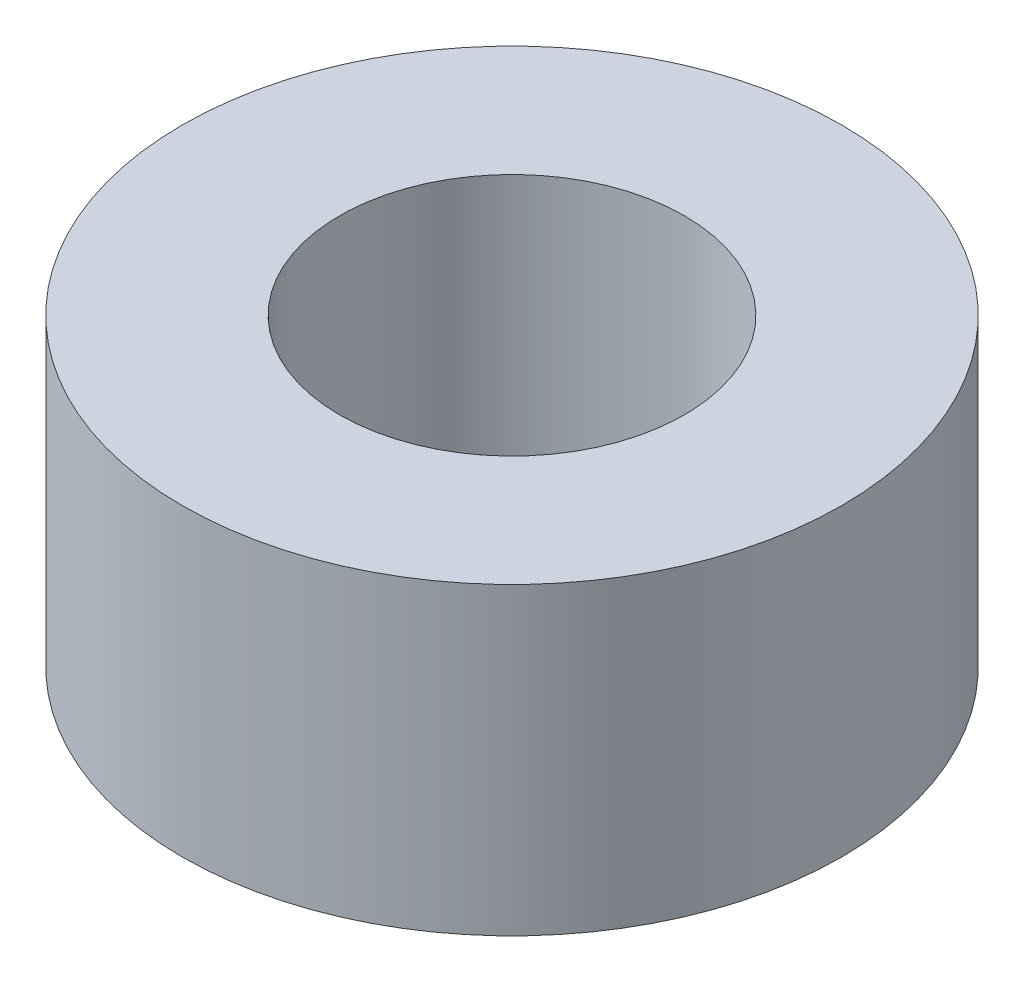
ISO-10303-21;
HEADER;
FILE_DESCRIPTION(('STEP AP214'),'2;1');
FILE_NAME('part.step','',(''),(''),'','','');
FILE_SCHEMA(('AUTOMOTIVE_DESIGN { 1 0 10303 214 1 1 1 1 }'));
ENDSEC;
DATA;
#1=APPLICATION_CONTEXT('core data for automotive mechanical design processes');
#2=APPLICATION_PROTOCOL_DEFINITION('international standard','automotive_design',2000,#1);
#3=PRODUCT_CONTEXT('',#1,'mechanical');
#4=PRODUCT('Part','Part','',(#3));
#5=PRODUCT_RELATED_PRODUCT_CATEGORY('part','',(#4));
#6=PRODUCT_DEFINITION_FORMATION('','',#4);
#7=PRODUCT_DEFINITION_CONTEXT('part definition',#1,'design');
#8=PRODUCT_DEFINITION('design','',#6,#7);
#9=PRODUCT_DEFINITION_SHAPE('','',#8);
#10=(LENGTH_UNIT() NAMED_UNIT(*) SI_UNIT(.MILLI.,.METRE.));
#11=(NAMED_UNIT(*) PLANE_ANGLE_UNIT() SI_UNIT($,.RADIAN.));
#12=(NAMED_UNIT(*) SI_UNIT($,.STERADIAN.) SOLID_ANGLE_UNIT());
#13=UNCERTAINTY_MEASURE_WITH_UNIT(LENGTH_MEASURE(1.E-05),#10,'distance_accuracy_value','');
#14=(GEOMETRIC_REPRESENTATION_CONTEXT(3) GLOBAL_UNCERTAINTY_ASSIGNED_CONTEXT((#13)) GLOBAL_UNIT_ASSIGNED_CONTEXT((#10,
#11,#12)) REPRESENTATION_CONTEXT('',''));
#15=CARTESIAN_POINT('',(0.,0.,0.));
#16=DIRECTION('',(0.,0.,1.));
#17=DIRECTION('',(1.,0.,0.));
#18=AXIS2_PLACEMENT_3D('',#15,#16,#17);
#19=CARTESIAN_POINT('',(0.,3.,0.));
#20=DIRECTION('',(0.,1.,0.));
#21=DIRECTION('',(0.,0.,1.));
#22=AXIS2_PLACEMENT_3D('',#19,#20,#21);
#23=PLANE('',#22);
#24=CARTESIAN_POINT('',(0.,3.,0.));
#25=DIRECTION('',(0.,1.,0.));
#26=DIRECTION('',(0.,0.,1.));
#27=AXIS2_PLACEMENT_3D('',#24,#25,#26);
#28=CIRCLE('',#27,3.25);
#29=CARTESIAN_POINT('',(0.,3.,3.25));
#30=VERTEX_POINT('',#29);
#31=EDGE_CURVE('E10',#30,#30,#28,.T.);
#32=ORIENTED_EDGE('',*,*,#31,.T.);
#33=EDGE_LOOP('',(#32));
#34=FACE_BOUND('',#33,.T.);
#35=CARTESIAN_POINT('',(0.,3.,0.));
#36=DIRECTION('',(0.,1.,0.));
#37=DIRECTION('',(0.,0.,1.));
#38=AXIS2_PLACEMENT_3D('',#35,#36,#37);
#39=CIRCLE('',#38,1.7);
#40=CARTESIAN_POINT('',(0.,3.,1.7));
#41=VERTEX_POINT('',#40);
#42=EDGE_CURVE('E48',#41,#41,#39,.T.);
#43=ORIENTED_EDGE('',*,*,#42,.F.);
#44=EDGE_LOOP('',(#43));
#45=FACE_BOUND('',#44,.T.);
#46=ADVANCED_FACE('F37',(#34,#45),#23,.T.);
#47=CARTESIAN_POINT('',(0.,0.,0.));
#48=DIRECTION('',(0.,1.,0.));
#49=DIRECTION('',(0.,0.,1.));
#50=AXIS2_PLACEMENT_3D('',#47,#48,#49);
#51=PLANE('',#50);
#52=CARTESIAN_POINT('',(0.,0.,0.));
#53=DIRECTION('',(0.,1.,0.));
#54=DIRECTION('',(0.,0.,1.));
#55=AXIS2_PLACEMENT_3D('',#52,#53,#54);
#56=CIRCLE('',#55,3.25);
#57=CARTESIAN_POINT('',(0.,0.,3.25));
#58=VERTEX_POINT('',#57);
#59=EDGE_CURVE('E41',#58,#58,#56,.T.);
#60=ORIENTED_EDGE('',*,*,#59,.F.);
#61=EDGE_LOOP('',(#60));
#62=FACE_BOUND('',#61,.T.);
#63=CARTESIAN_POINT('',(0.,0.,0.));
#64=DIRECTION('',(0.,1.,0.));
#65=DIRECTION('',(0.,0.,1.));
#66=AXIS2_PLACEMENT_3D('',#63,#64,#65);
#67=CIRCLE('',#66,1.7);
#68=CARTESIAN_POINT('',(0.,0.,1.7));
#69=VERTEX_POINT('',#68);
#70=EDGE_CURVE('E50',#69,#69,#67,.T.);
#71=ORIENTED_EDGE('',*,*,#70,.T.);
#72=EDGE_LOOP('',(#71));
#73=FACE_BOUND('',#72,.T.);
#74=ADVANCED_FACE('F60',(#62,#73),#51,.F.);
#75=CARTESIAN_POINT('',(0.,3.,0.));
#76=DIRECTION('',(0.,-1.,0.));
#77=DIRECTION('',(0.,0.,-1.));
#78=AXIS2_PLACEMENT_3D('',#75,#76,#77);
#79=CYLINDRICAL_SURFACE('',#78,3.25);
#80=ORIENTED_EDGE('',*,*,#31,.F.);
#81=EDGE_LOOP('',(#80));
#82=FACE_BOUND('',#81,.T.);
#83=ORIENTED_EDGE('',*,*,#59,.T.);
#84=EDGE_LOOP('',(#83));
#85=FACE_BOUND('',#84,.T.);
#86=ADVANCED_FACE('F39',(#82,#85),#79,.T.);
#87=CARTESIAN_POINT('',(0.,3.,0.));
#88=DIRECTION('',(0.,-1.,0.));
#89=DIRECTION('',(0.,0.,-1.));
#90=AXIS2_PLACEMENT_3D('',#87,#88,#89);
#91=CYLINDRICAL_SURFACE('',#90,1.7);
#92=ORIENTED_EDGE('',*,*,#42,.T.);
#93=EDGE_LOOP('',(#92));
#94=FACE_BOUND('',#93,.T.);
#95=ORIENTED_EDGE('',*,*,#70,.F.);
#96=EDGE_LOOP('',(#95));
#97=FACE_BOUND('',#96,.T.);
#98=ADVANCED_FACE('F56',(#94,#97),#91,.F.);
#99=CLOSED_SHELL('',(#46,#74,#86,#98));
#100=MANIFOLD_SOLID_BREP('B2',#99);
#101=ADVANCED_BREP_SHAPE_REPRESENTATION('',(#18,#100),#14);
#102=SHAPE_DEFINITION_REPRESENTATION(#9,#101);
ENDSEC;
END-ISO-10303-21;
